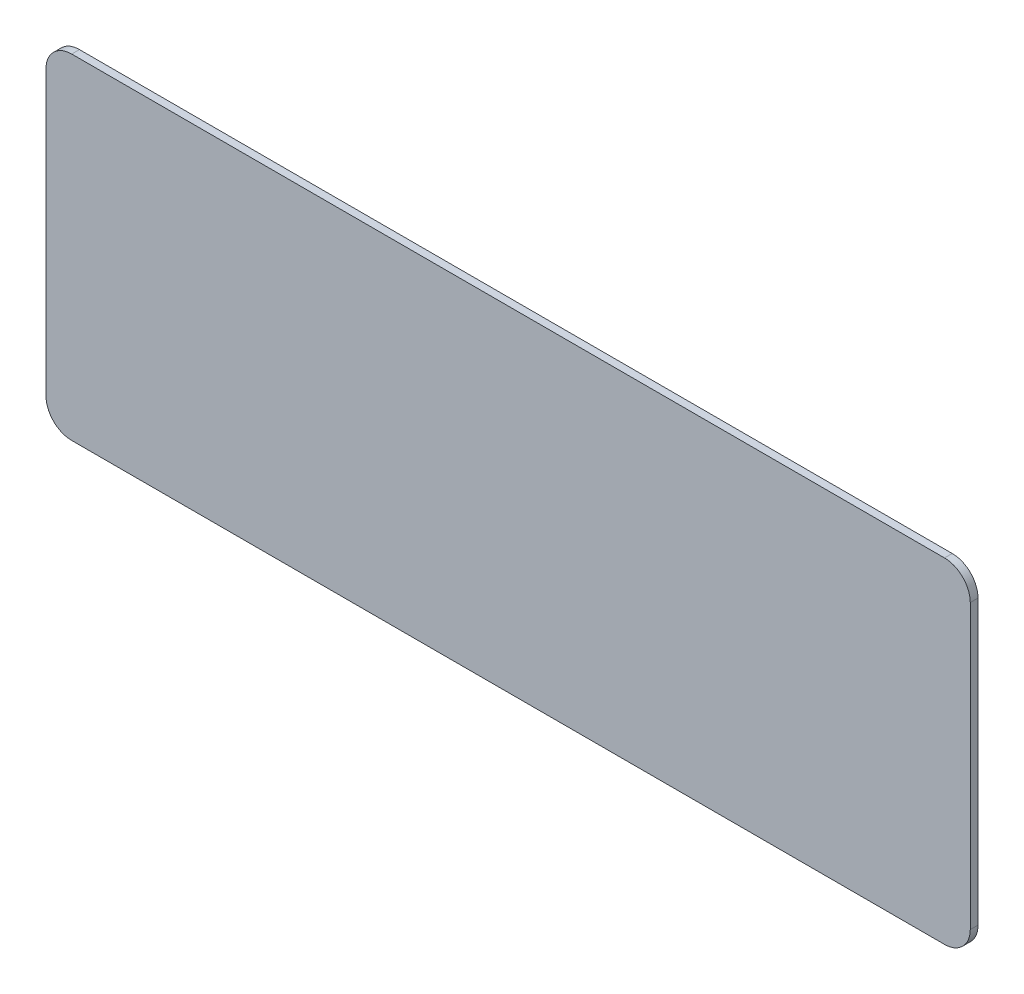
ISO-10303-21;
HEADER;
FILE_DESCRIPTION(('STEP AP214'),'2;1');
FILE_NAME('part.step','',(''),(''),'','','');
FILE_SCHEMA(('AUTOMOTIVE_DESIGN { 1 0 10303 214 1 1 1 1 }'));
ENDSEC;
DATA;
#1=APPLICATION_CONTEXT('core data for automotive mechanical design processes');
#2=APPLICATION_PROTOCOL_DEFINITION('international standard','automotive_design',2000,#1);
#3=PRODUCT_CONTEXT('',#1,'mechanical');
#4=PRODUCT('Part','Part','',(#3));
#5=PRODUCT_RELATED_PRODUCT_CATEGORY('part','',(#4));
#6=PRODUCT_DEFINITION_FORMATION('','',#4);
#7=PRODUCT_DEFINITION_CONTEXT('part definition',#1,'design');
#8=PRODUCT_DEFINITION('design','',#6,#7);
#9=PRODUCT_DEFINITION_SHAPE('','',#8);
#10=(LENGTH_UNIT() NAMED_UNIT(*) SI_UNIT(.MILLI.,.METRE.));
#11=(NAMED_UNIT(*) PLANE_ANGLE_UNIT() SI_UNIT($,.RADIAN.));
#12=(NAMED_UNIT(*) SI_UNIT($,.STERADIAN.) SOLID_ANGLE_UNIT());
#13=UNCERTAINTY_MEASURE_WITH_UNIT(LENGTH_MEASURE(1.E-05),#10,'distance_accuracy_value','');
#14=(GEOMETRIC_REPRESENTATION_CONTEXT(3) GLOBAL_UNCERTAINTY_ASSIGNED_CONTEXT((#13)) GLOBAL_UNIT_ASSIGNED_CONTEXT((#10,
#11,#12)) REPRESENTATION_CONTEXT('',''));
#15=CARTESIAN_POINT('',(0.,0.,0.));
#16=DIRECTION('',(0.,0.,1.));
#17=DIRECTION('',(1.,0.,0.));
#18=AXIS2_PLACEMENT_3D('',#15,#16,#17);
#19=CARTESIAN_POINT('',(179.5,65.,3.));
#20=DIRECTION('',(-1.,0.,0.));
#21=DIRECTION('',(0.,-1.,0.));
#22=AXIS2_PLACEMENT_3D('',#19,#20,#21);
#23=PLANE('',#22);
#24=DIRECTION('',(0.,1.,0.));
#25=VECTOR('',#24,1.);
#26=CARTESIAN_POINT('',(179.5,65.,0.));
#27=LINE('',#26,#25);
#28=CARTESIAN_POINT('',(179.5,-55.,0.));
#29=VERTEX_POINT('',#28);
#30=CARTESIAN_POINT('',(179.5,55.,0.));
#31=VERTEX_POINT('',#30);
#32=EDGE_CURVE('E128',#29,#31,#27,.T.);
#33=ORIENTED_EDGE('',*,*,#32,.T.);
#34=DIRECTION('',(0.,0.,-1.));
#35=VECTOR('',#34,1.);
#36=CARTESIAN_POINT('',(179.5,55.,3.));
#37=LINE('',#36,#35);
#38=CARTESIAN_POINT('',(179.5,55.,3.));
#39=VERTEX_POINT('',#38);
#40=EDGE_CURVE('E151',#31,#39,#37,.F.);
#41=ORIENTED_EDGE('',*,*,#40,.T.);
#42=DIRECTION('',(0.,1.,0.));
#43=VECTOR('',#42,1.);
#44=CARTESIAN_POINT('',(179.5,65.,3.));
#45=LINE('',#44,#43);
#46=CARTESIAN_POINT('',(179.5,-55.,3.));
#47=VERTEX_POINT('',#46);
#48=EDGE_CURVE('E126',#47,#39,#45,.T.);
#49=ORIENTED_EDGE('',*,*,#48,.F.);
#50=DIRECTION('',(0.,0.,-1.));
#51=VECTOR('',#50,1.);
#52=CARTESIAN_POINT('',(179.5,-55.,3.));
#53=LINE('',#52,#51);
#54=EDGE_CURVE('E148',#47,#29,#53,.T.);
#55=ORIENTED_EDGE('',*,*,#54,.T.);
#56=EDGE_LOOP('',(#33,#41,#49,#55));
#57=FACE_BOUND('',#56,.T.);
#58=ADVANCED_FACE('F33',(#57),#23,.F.);
#59=CARTESIAN_POINT('',(-179.5,65.,3.));
#60=DIRECTION('',(0.,-1.,0.));
#61=DIRECTION('',(0.,0.,-1.));
#62=AXIS2_PLACEMENT_3D('',#59,#60,#61);
#63=PLANE('',#62);
#64=DIRECTION('',(-1.,0.,0.));
#65=VECTOR('',#64,1.);
#66=CARTESIAN_POINT('',(-179.5,65.,0.));
#67=LINE('',#66,#65);
#68=CARTESIAN_POINT('',(169.5,65.,0.));
#69=VERTEX_POINT('',#68);
#70=CARTESIAN_POINT('',(-169.5,65.,0.));
#71=VERTEX_POINT('',#70);
#72=EDGE_CURVE('E124',#69,#71,#67,.T.);
#73=ORIENTED_EDGE('',*,*,#72,.T.);
#74=DIRECTION('',(0.,0.,-1.));
#75=VECTOR('',#74,1.);
#76=CARTESIAN_POINT('',(-169.5,65.,3.));
#77=LINE('',#76,#75);
#78=CARTESIAN_POINT('',(-169.5,65.,3.));
#79=VERTEX_POINT('',#78);
#80=EDGE_CURVE('E103',#71,#79,#77,.F.);
#81=ORIENTED_EDGE('',*,*,#80,.T.);
#82=DIRECTION('',(-1.,0.,0.));
#83=VECTOR('',#82,1.);
#84=CARTESIAN_POINT('',(-179.5,65.,3.));
#85=LINE('',#84,#83);
#86=CARTESIAN_POINT('',(169.5,65.,3.));
#87=VERTEX_POINT('',#86);
#88=EDGE_CURVE('E167',#87,#79,#85,.T.);
#89=ORIENTED_EDGE('',*,*,#88,.F.);
#90=DIRECTION('',(0.,0.,-1.));
#91=VECTOR('',#90,1.);
#92=CARTESIAN_POINT('',(169.5,65.,3.));
#93=LINE('',#92,#91);
#94=EDGE_CURVE('E108',#87,#69,#93,.T.);
#95=ORIENTED_EDGE('',*,*,#94,.T.);
#96=EDGE_LOOP('',(#73,#81,#89,#95));
#97=FACE_BOUND('',#96,.T.);
#98=ADVANCED_FACE('F184',(#97),#63,.F.);
#99=CARTESIAN_POINT('',(-179.5,65.,3.));
#100=DIRECTION('',(1.,0.,0.));
#101=DIRECTION('',(0.,1.,0.));
#102=AXIS2_PLACEMENT_3D('',#99,#100,#101);
#103=PLANE('',#102);
#104=DIRECTION('',(0.,-1.,0.));
#105=VECTOR('',#104,1.);
#106=CARTESIAN_POINT('',(-179.5,65.,3.));
#107=LINE('',#106,#105);
#108=CARTESIAN_POINT('',(-179.5,55.,3.));
#109=VERTEX_POINT('',#108);
#110=CARTESIAN_POINT('',(-179.5,-55.,3.));
#111=VERTEX_POINT('',#110);
#112=EDGE_CURVE('E117',#109,#111,#107,.T.);
#113=ORIENTED_EDGE('',*,*,#112,.F.);
#114=DIRECTION('',(0.,0.,-1.));
#115=VECTOR('',#114,1.);
#116=CARTESIAN_POINT('',(-179.5,55.,3.));
#117=LINE('',#116,#115);
#118=CARTESIAN_POINT('',(-179.5,55.,0.));
#119=VERTEX_POINT('',#118);
#120=EDGE_CURVE('E102',#109,#119,#117,.T.);
#121=ORIENTED_EDGE('',*,*,#120,.T.);
#122=DIRECTION('',(0.,-1.,0.));
#123=VECTOR('',#122,1.);
#124=CARTESIAN_POINT('',(-179.5,65.,0.));
#125=LINE('',#124,#123);
#126=CARTESIAN_POINT('',(-179.5,-55.,0.));
#127=VERTEX_POINT('',#126);
#128=EDGE_CURVE('E115',#119,#127,#125,.T.);
#129=ORIENTED_EDGE('',*,*,#128,.T.);
#130=DIRECTION('',(0.,0.,-1.));
#131=VECTOR('',#130,1.);
#132=CARTESIAN_POINT('',(-179.5,-55.,3.));
#133=LINE('',#132,#131);
#134=EDGE_CURVE('E119',#127,#111,#133,.F.);
#135=ORIENTED_EDGE('',*,*,#134,.T.);
#136=EDGE_LOOP('',(#113,#121,#129,#135));
#137=FACE_BOUND('',#136,.T.);
#138=ADVANCED_FACE('F114',(#137),#103,.F.);
#139=CARTESIAN_POINT('',(-179.5,-65.,3.));
#140=DIRECTION('',(0.,1.,0.));
#141=DIRECTION('',(0.,0.,1.));
#142=AXIS2_PLACEMENT_3D('',#139,#140,#141);
#143=PLANE('',#142);
#144=DIRECTION('',(1.,0.,0.));
#145=VECTOR('',#144,1.);
#146=CARTESIAN_POINT('',(-179.5,-65.,0.));
#147=LINE('',#146,#145);
#148=CARTESIAN_POINT('',(-169.5,-65.,0.));
#149=VERTEX_POINT('',#148);
#150=CARTESIAN_POINT('',(169.5,-65.,0.));
#151=VERTEX_POINT('',#150);
#152=EDGE_CURVE('E123',#149,#151,#147,.T.);
#153=ORIENTED_EDGE('',*,*,#152,.T.);
#154=DIRECTION('',(0.,0.,-1.));
#155=VECTOR('',#154,1.);
#156=CARTESIAN_POINT('',(169.5,-65.,3.));
#157=LINE('',#156,#155);
#158=CARTESIAN_POINT('',(169.5,-65.,3.));
#159=VERTEX_POINT('',#158);
#160=EDGE_CURVE('E11',#151,#159,#157,.F.);
#161=ORIENTED_EDGE('',*,*,#160,.T.);
#162=DIRECTION('',(1.,0.,0.));
#163=VECTOR('',#162,1.);
#164=CARTESIAN_POINT('',(-179.5,-65.,3.));
#165=LINE('',#164,#163);
#166=CARTESIAN_POINT('',(-169.5,-65.,3.));
#167=VERTEX_POINT('',#166);
#168=EDGE_CURVE('E132',#167,#159,#165,.T.);
#169=ORIENTED_EDGE('',*,*,#168,.F.);
#170=DIRECTION('',(0.,0.,-1.));
#171=VECTOR('',#170,1.);
#172=CARTESIAN_POINT('',(-169.5,-65.,3.));
#173=LINE('',#172,#171);
#174=EDGE_CURVE('E41',#167,#149,#173,.T.);
#175=ORIENTED_EDGE('',*,*,#174,.T.);
#176=EDGE_LOOP('',(#153,#161,#169,#175));
#177=FACE_BOUND('',#176,.T.);
#178=ADVANCED_FACE('F154',(#177),#143,.F.);
#179=CARTESIAN_POINT('',(0.,0.,3.));
#180=DIRECTION('',(0.,0.,1.));
#181=DIRECTION('',(1.,0.,0.));
#182=AXIS2_PLACEMENT_3D('',#179,#180,#181);
#183=PLANE('',#182);
#184=ORIENTED_EDGE('',*,*,#88,.T.);
#185=CARTESIAN_POINT('',(-169.5,55.,3.));
#186=DIRECTION('',(0.,0.,1.));
#187=DIRECTION('',(1.,0.,0.));
#188=AXIS2_PLACEMENT_3D('',#185,#186,#187);
#189=CIRCLE('',#188,10.);
#190=EDGE_CURVE('E146',#79,#109,#189,.T.);
#191=ORIENTED_EDGE('',*,*,#190,.T.);
#192=ORIENTED_EDGE('',*,*,#112,.T.);
#193=CARTESIAN_POINT('',(-169.5,-55.,3.));
#194=DIRECTION('',(0.,0.,1.));
#195=DIRECTION('',(1.,0.,0.));
#196=AXIS2_PLACEMENT_3D('',#193,#194,#195);
#197=CIRCLE('',#196,10.);
#198=EDGE_CURVE('E53',#111,#167,#197,.T.);
#199=ORIENTED_EDGE('',*,*,#198,.T.);
#200=ORIENTED_EDGE('',*,*,#168,.T.);
#201=CARTESIAN_POINT('',(169.5,-55.,3.));
#202=DIRECTION('',(0.,0.,1.));
#203=DIRECTION('',(1.,0.,0.));
#204=AXIS2_PLACEMENT_3D('',#201,#202,#203);
#205=CIRCLE('',#204,10.);
#206=EDGE_CURVE('E142',#159,#47,#205,.T.);
#207=ORIENTED_EDGE('',*,*,#206,.T.);
#208=ORIENTED_EDGE('',*,*,#48,.T.);
#209=CARTESIAN_POINT('',(169.5,55.,3.));
#210=DIRECTION('',(0.,0.,1.));
#211=DIRECTION('',(1.,0.,0.));
#212=AXIS2_PLACEMENT_3D('',#209,#210,#211);
#213=CIRCLE('',#212,10.);
#214=EDGE_CURVE('E144',#39,#87,#213,.T.);
#215=ORIENTED_EDGE('',*,*,#214,.T.);
#216=EDGE_LOOP('',(#184,#191,#192,#199,#200,#207,#208,#215));
#217=FACE_BOUND('',#216,.T.);
#218=ADVANCED_FACE('F173',(#217),#183,.T.);
#219=CARTESIAN_POINT('',(0.,0.,0.));
#220=DIRECTION('',(0.,0.,1.));
#221=DIRECTION('',(1.,0.,0.));
#222=AXIS2_PLACEMENT_3D('',#219,#220,#221);
#223=PLANE('',#222);
#224=ORIENTED_EDGE('',*,*,#128,.F.);
#225=CARTESIAN_POINT('',(-169.5,55.,0.));
#226=DIRECTION('',(0.,0.,1.));
#227=DIRECTION('',(1.,0.,0.));
#228=AXIS2_PLACEMENT_3D('',#225,#226,#227);
#229=CIRCLE('',#228,10.);
#230=EDGE_CURVE('E98',#119,#71,#229,.F.);
#231=ORIENTED_EDGE('',*,*,#230,.T.);
#232=ORIENTED_EDGE('',*,*,#72,.F.);
#233=CARTESIAN_POINT('',(169.5,55.,0.));
#234=DIRECTION('',(0.,0.,1.));
#235=DIRECTION('',(1.,0.,0.));
#236=AXIS2_PLACEMENT_3D('',#233,#234,#235);
#237=CIRCLE('',#236,10.);
#238=EDGE_CURVE('E109',#69,#31,#237,.F.);
#239=ORIENTED_EDGE('',*,*,#238,.T.);
#240=ORIENTED_EDGE('',*,*,#32,.F.);
#241=CARTESIAN_POINT('',(169.5,-55.,0.));
#242=DIRECTION('',(0.,0.,1.));
#243=DIRECTION('',(1.,0.,0.));
#244=AXIS2_PLACEMENT_3D('',#241,#242,#243);
#245=CIRCLE('',#244,10.);
#246=EDGE_CURVE('E135',#29,#151,#245,.F.);
#247=ORIENTED_EDGE('',*,*,#246,.T.);
#248=ORIENTED_EDGE('',*,*,#152,.F.);
#249=CARTESIAN_POINT('',(-169.5,-55.,0.));
#250=DIRECTION('',(0.,0.,1.));
#251=DIRECTION('',(1.,0.,0.));
#252=AXIS2_PLACEMENT_3D('',#249,#250,#251);
#253=CIRCLE('',#252,10.);
#254=EDGE_CURVE('E118',#149,#127,#253,.F.);
#255=ORIENTED_EDGE('',*,*,#254,.T.);
#256=EDGE_LOOP('',(#224,#231,#232,#239,#240,#247,#248,#255));
#257=FACE_BOUND('',#256,.T.);
#258=ADVANCED_FACE('F121',(#257),#223,.F.);
#259=CARTESIAN_POINT('',(-169.5,55.,3.));
#260=DIRECTION('',(0.,0.,-1.));
#261=DIRECTION('',(-1.,0.,0.));
#262=AXIS2_PLACEMENT_3D('',#259,#260,#261);
#263=CYLINDRICAL_SURFACE('',#262,10.);
#264=ORIENTED_EDGE('',*,*,#190,.F.);
#265=ORIENTED_EDGE('',*,*,#80,.F.);
#266=ORIENTED_EDGE('',*,*,#230,.F.);
#267=ORIENTED_EDGE('',*,*,#120,.F.);
#268=EDGE_LOOP('',(#264,#265,#266,#267));
#269=FACE_BOUND('',#268,.T.);
#270=ADVANCED_FACE('F101',(#269),#263,.T.);
#271=CARTESIAN_POINT('',(169.5,55.,3.));
#272=DIRECTION('',(0.,0.,-1.));
#273=DIRECTION('',(-1.,0.,0.));
#274=AXIS2_PLACEMENT_3D('',#271,#272,#273);
#275=CYLINDRICAL_SURFACE('',#274,10.);
#276=ORIENTED_EDGE('',*,*,#214,.F.);
#277=ORIENTED_EDGE('',*,*,#40,.F.);
#278=ORIENTED_EDGE('',*,*,#238,.F.);
#279=ORIENTED_EDGE('',*,*,#94,.F.);
#280=EDGE_LOOP('',(#276,#277,#278,#279));
#281=FACE_BOUND('',#280,.T.);
#282=ADVANCED_FACE('F195',(#281),#275,.T.);
#283=CARTESIAN_POINT('',(169.5,-55.,3.));
#284=DIRECTION('',(0.,0.,-1.));
#285=DIRECTION('',(-1.,0.,0.));
#286=AXIS2_PLACEMENT_3D('',#283,#284,#285);
#287=CYLINDRICAL_SURFACE('',#286,10.);
#288=ORIENTED_EDGE('',*,*,#206,.F.);
#289=ORIENTED_EDGE('',*,*,#160,.F.);
#290=ORIENTED_EDGE('',*,*,#246,.F.);
#291=ORIENTED_EDGE('',*,*,#54,.F.);
#292=EDGE_LOOP('',(#288,#289,#290,#291));
#293=FACE_BOUND('',#292,.T.);
#294=ADVANCED_FACE('F161',(#293),#287,.T.);
#295=CARTESIAN_POINT('',(-169.5,-55.,3.));
#296=DIRECTION('',(0.,0.,-1.));
#297=DIRECTION('',(-1.,0.,0.));
#298=AXIS2_PLACEMENT_3D('',#295,#296,#297);
#299=CYLINDRICAL_SURFACE('',#298,10.);
#300=ORIENTED_EDGE('',*,*,#198,.F.);
#301=ORIENTED_EDGE('',*,*,#134,.F.);
#302=ORIENTED_EDGE('',*,*,#254,.F.);
#303=ORIENTED_EDGE('',*,*,#174,.F.);
#304=EDGE_LOOP('',(#300,#301,#302,#303));
#305=FACE_BOUND('',#304,.T.);
#306=ADVANCED_FACE('F35',(#305),#299,.T.);
#307=CLOSED_SHELL('',(#58,#98,#138,#178,#218,#258,#270,#282,#294,#306));
#308=MANIFOLD_SOLID_BREP('B2',#307);
#309=ADVANCED_BREP_SHAPE_REPRESENTATION('',(#18,#308),#14);
#310=SHAPE_DEFINITION_REPRESENTATION(#9,#309);
ENDSEC;
END-ISO-10303-21;
